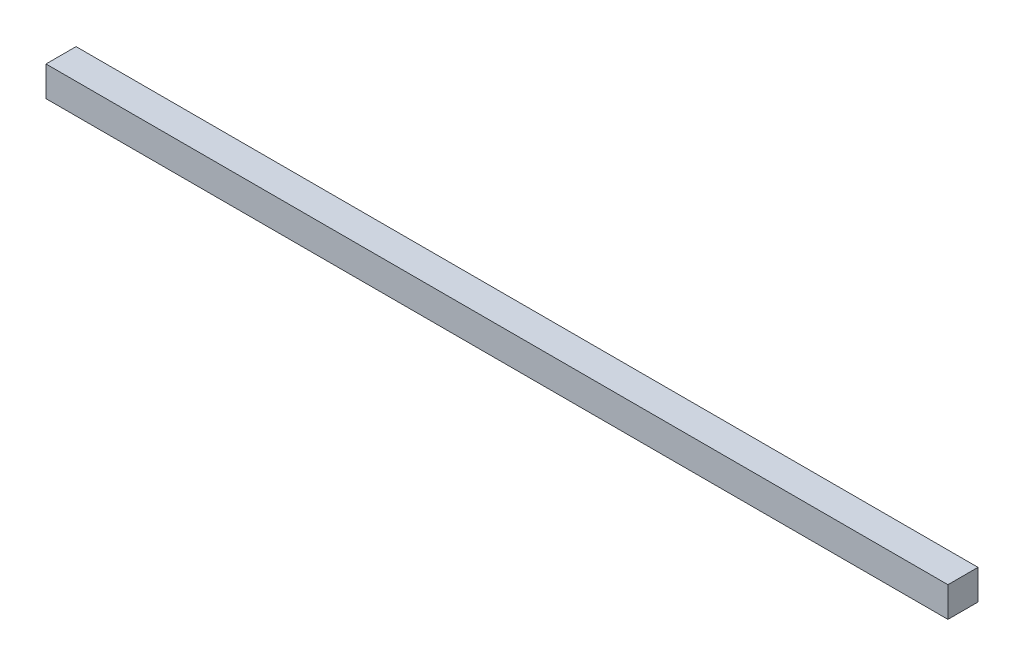
ISO-10303-21;
HEADER;
FILE_DESCRIPTION(('STEP AP214'),'2;1');
FILE_NAME('part.step','',(''),(''),'','','');
FILE_SCHEMA(('AUTOMOTIVE_DESIGN { 1 0 10303 214 1 1 1 1 }'));
ENDSEC;
DATA;
#1=APPLICATION_CONTEXT('core data for automotive mechanical design processes');
#2=APPLICATION_PROTOCOL_DEFINITION('international standard','automotive_design',2000,#1);
#3=PRODUCT_CONTEXT('',#1,'mechanical');
#4=PRODUCT('Part','Part','',(#3));
#5=PRODUCT_RELATED_PRODUCT_CATEGORY('part','',(#4));
#6=PRODUCT_DEFINITION_FORMATION('','',#4);
#7=PRODUCT_DEFINITION_CONTEXT('part definition',#1,'design');
#8=PRODUCT_DEFINITION('design','',#6,#7);
#9=PRODUCT_DEFINITION_SHAPE('','',#8);
#10=(LENGTH_UNIT() NAMED_UNIT(*) SI_UNIT(.MILLI.,.METRE.));
#11=(NAMED_UNIT(*) PLANE_ANGLE_UNIT() SI_UNIT($,.RADIAN.));
#12=(NAMED_UNIT(*) SI_UNIT($,.STERADIAN.) SOLID_ANGLE_UNIT());
#13=UNCERTAINTY_MEASURE_WITH_UNIT(LENGTH_MEASURE(1.E-05),#10,'distance_accuracy_value','');
#14=(GEOMETRIC_REPRESENTATION_CONTEXT(3) GLOBAL_UNCERTAINTY_ASSIGNED_CONTEXT((#13)) GLOBAL_UNIT_ASSIGNED_CONTEXT((#10,
#11,#12)) REPRESENTATION_CONTEXT('',''));
#15=CARTESIAN_POINT('',(0.,0.,0.));
#16=DIRECTION('',(0.,0.,1.));
#17=DIRECTION('',(1.,0.,0.));
#18=AXIS2_PLACEMENT_3D('',#15,#16,#17);
#19=CARTESIAN_POINT('',(180.,498.,148.));
#20=DIRECTION('',(1.,0.,0.));
#21=DIRECTION('',(0.,0.,-1.));
#22=AXIS2_PLACEMENT_3D('',#19,#20,#21);
#23=PLANE('',#22);
#24=DIRECTION('',(0.,0.,1.));
#25=VECTOR('',#24,1.);
#26=CARTESIAN_POINT('',(180.,490.,148.));
#27=LINE('',#26,#25);
#28=CARTESIAN_POINT('',(180.,490.,148.));
#29=VERTEX_POINT('',#28);
#30=CARTESIAN_POINT('',(180.,490.,156.));
#31=VERTEX_POINT('',#30);
#32=EDGE_CURVE('E105',#29,#31,#27,.T.);
#33=ORIENTED_EDGE('',*,*,#32,.T.);
#34=DIRECTION('',(0.,-1.,0.));
#35=VECTOR('',#34,1.);
#36=CARTESIAN_POINT('',(180.,498.,156.));
#37=LINE('',#36,#35);
#38=CARTESIAN_POINT('',(180.,498.,156.));
#39=VERTEX_POINT('',#38);
#40=EDGE_CURVE('E11',#39,#31,#37,.T.);
#41=ORIENTED_EDGE('',*,*,#40,.F.);
#42=DIRECTION('',(0.,0.,1.));
#43=VECTOR('',#42,1.);
#44=CARTESIAN_POINT('',(180.,498.,148.));
#45=LINE('',#44,#43);
#46=CARTESIAN_POINT('',(180.,498.,148.));
#47=VERTEX_POINT('',#46);
#48=EDGE_CURVE('E89',#47,#39,#45,.T.);
#49=ORIENTED_EDGE('',*,*,#48,.F.);
#50=DIRECTION('',(0.,-1.,0.));
#51=VECTOR('',#50,1.);
#52=CARTESIAN_POINT('',(180.,498.,148.));
#53=LINE('',#52,#51);
#54=EDGE_CURVE('E97',#47,#29,#53,.T.);
#55=ORIENTED_EDGE('',*,*,#54,.T.);
#56=EDGE_LOOP('',(#33,#41,#49,#55));
#57=FACE_BOUND('',#56,.T.);
#58=ADVANCED_FACE('F39',(#57),#23,.F.);
#59=CARTESIAN_POINT('',(180.,498.,156.));
#60=DIRECTION('',(0.,0.,-1.));
#61=DIRECTION('',(-1.,0.,0.));
#62=AXIS2_PLACEMENT_3D('',#59,#60,#61);
#63=PLANE('',#62);
#64=DIRECTION('',(1.,0.,0.));
#65=VECTOR('',#64,1.);
#66=CARTESIAN_POINT('',(180.,490.,156.));
#67=LINE('',#66,#65);
#68=CARTESIAN_POINT('',(420.,490.,156.));
#69=VERTEX_POINT('',#68);
#70=EDGE_CURVE('E92',#31,#69,#67,.T.);
#71=ORIENTED_EDGE('',*,*,#70,.T.);
#72=DIRECTION('',(0.,-1.,0.));
#73=VECTOR('',#72,1.);
#74=CARTESIAN_POINT('',(420.,498.,156.));
#75=LINE('',#74,#73);
#76=CARTESIAN_POINT('',(420.,498.,156.));
#77=VERTEX_POINT('',#76);
#78=EDGE_CURVE('E50',#77,#69,#75,.T.);
#79=ORIENTED_EDGE('',*,*,#78,.F.);
#80=DIRECTION('',(1.,0.,0.));
#81=VECTOR('',#80,1.);
#82=CARTESIAN_POINT('',(180.,498.,156.));
#83=LINE('',#82,#81);
#84=EDGE_CURVE('E82',#39,#77,#83,.T.);
#85=ORIENTED_EDGE('',*,*,#84,.F.);
#86=ORIENTED_EDGE('',*,*,#40,.T.);
#87=EDGE_LOOP('',(#71,#79,#85,#86));
#88=FACE_BOUND('',#87,.T.);
#89=ADVANCED_FACE('F93',(#88),#63,.F.);
#90=CARTESIAN_POINT('',(420.,498.,148.));
#91=DIRECTION('',(-1.,0.,0.));
#92=DIRECTION('',(0.,0.,1.));
#93=AXIS2_PLACEMENT_3D('',#90,#91,#92);
#94=PLANE('',#93);
#95=DIRECTION('',(0.,0.,-1.));
#96=VECTOR('',#95,1.);
#97=CARTESIAN_POINT('',(420.,490.,148.));
#98=LINE('',#97,#96);
#99=CARTESIAN_POINT('',(420.,490.,148.));
#100=VERTEX_POINT('',#99);
#101=EDGE_CURVE('E72',#69,#100,#98,.T.);
#102=ORIENTED_EDGE('',*,*,#101,.T.);
#103=DIRECTION('',(0.,-1.,0.));
#104=VECTOR('',#103,1.);
#105=CARTESIAN_POINT('',(420.,498.,148.));
#106=LINE('',#105,#104);
#107=CARTESIAN_POINT('',(420.,498.,148.));
#108=VERTEX_POINT('',#107);
#109=EDGE_CURVE('E94',#108,#100,#106,.T.);
#110=ORIENTED_EDGE('',*,*,#109,.F.);
#111=DIRECTION('',(0.,0.,-1.));
#112=VECTOR('',#111,1.);
#113=CARTESIAN_POINT('',(420.,498.,148.));
#114=LINE('',#113,#112);
#115=EDGE_CURVE('E88',#77,#108,#114,.T.);
#116=ORIENTED_EDGE('',*,*,#115,.F.);
#117=ORIENTED_EDGE('',*,*,#78,.T.);
#118=EDGE_LOOP('',(#102,#110,#116,#117));
#119=FACE_BOUND('',#118,.T.);
#120=ADVANCED_FACE('F96',(#119),#94,.F.);
#121=CARTESIAN_POINT('',(180.,498.,148.));
#122=DIRECTION('',(0.,0.,1.));
#123=DIRECTION('',(1.,0.,0.));
#124=AXIS2_PLACEMENT_3D('',#121,#122,#123);
#125=PLANE('',#124);
#126=DIRECTION('',(-1.,0.,0.));
#127=VECTOR('',#126,1.);
#128=CARTESIAN_POINT('',(180.,490.,148.));
#129=LINE('',#128,#127);
#130=EDGE_CURVE('E76',#100,#29,#129,.T.);
#131=ORIENTED_EDGE('',*,*,#130,.T.);
#132=ORIENTED_EDGE('',*,*,#54,.F.);
#133=DIRECTION('',(-1.,0.,0.));
#134=VECTOR('',#133,1.);
#135=CARTESIAN_POINT('',(180.,498.,148.));
#136=LINE('',#135,#134);
#137=EDGE_CURVE('E54',#108,#47,#136,.T.);
#138=ORIENTED_EDGE('',*,*,#137,.F.);
#139=ORIENTED_EDGE('',*,*,#109,.T.);
#140=EDGE_LOOP('',(#131,#132,#138,#139));
#141=FACE_BOUND('',#140,.T.);
#142=ADVANCED_FACE('F108',(#141),#125,.F.);
#143=CARTESIAN_POINT('',(0.,498.,0.));
#144=DIRECTION('',(0.,1.,0.));
#145=DIRECTION('',(0.,0.,1.));
#146=AXIS2_PLACEMENT_3D('',#143,#144,#145);
#147=PLANE('',#146);
#148=ORIENTED_EDGE('',*,*,#48,.T.);
#149=ORIENTED_EDGE('',*,*,#84,.T.);
#150=ORIENTED_EDGE('',*,*,#115,.T.);
#151=ORIENTED_EDGE('',*,*,#137,.T.);
#152=EDGE_LOOP('',(#148,#149,#150,#151));
#153=FACE_BOUND('',#152,.T.);
#154=ADVANCED_FACE('F86',(#153),#147,.T.);
#155=CARTESIAN_POINT('',(0.,490.,0.));
#156=DIRECTION('',(0.,1.,0.));
#157=DIRECTION('',(0.,0.,1.));
#158=AXIS2_PLACEMENT_3D('',#155,#156,#157);
#159=PLANE('',#158);
#160=ORIENTED_EDGE('',*,*,#32,.F.);
#161=ORIENTED_EDGE('',*,*,#130,.F.);
#162=ORIENTED_EDGE('',*,*,#101,.F.);
#163=ORIENTED_EDGE('',*,*,#70,.F.);
#164=EDGE_LOOP('',(#160,#161,#162,#163));
#165=FACE_BOUND('',#164,.T.);
#166=ADVANCED_FACE('F115',(#165),#159,.F.);
#167=CLOSED_SHELL('',(#58,#89,#120,#142,#154,#166));
#168=MANIFOLD_SOLID_BREP('B2',#167);
#169=ADVANCED_BREP_SHAPE_REPRESENTATION('',(#18,#168),#14);
#170=SHAPE_DEFINITION_REPRESENTATION(#9,#169);
ENDSEC;
END-ISO-10303-21;
